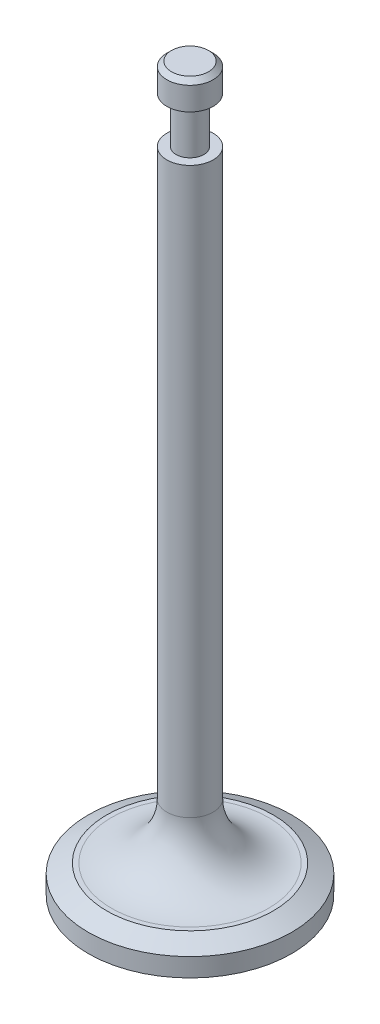
ISO-10303-21;
HEADER;
FILE_DESCRIPTION(('STEP AP214'),'2;1');
FILE_NAME('part.step','',(''),(''),'','','');
FILE_SCHEMA(('AUTOMOTIVE_DESIGN { 1 0 10303 214 1 1 1 1 }'));
ENDSEC;
DATA;
#1=APPLICATION_CONTEXT('core data for automotive mechanical design processes');
#2=APPLICATION_PROTOCOL_DEFINITION('international standard','automotive_design',2000,#1);
#3=PRODUCT_CONTEXT('',#1,'mechanical');
#4=PRODUCT('Part','Part','',(#3));
#5=PRODUCT_RELATED_PRODUCT_CATEGORY('part','',(#4));
#6=PRODUCT_DEFINITION_FORMATION('','',#4);
#7=PRODUCT_DEFINITION_CONTEXT('part definition',#1,'design');
#8=PRODUCT_DEFINITION('design','',#6,#7);
#9=PRODUCT_DEFINITION_SHAPE('','',#8);
#10=(LENGTH_UNIT() NAMED_UNIT(*) SI_UNIT(.MILLI.,.METRE.));
#11=(NAMED_UNIT(*) PLANE_ANGLE_UNIT() SI_UNIT($,.RADIAN.));
#12=(NAMED_UNIT(*) SI_UNIT($,.STERADIAN.) SOLID_ANGLE_UNIT());
#13=UNCERTAINTY_MEASURE_WITH_UNIT(LENGTH_MEASURE(1.E-05),#10,'distance_accuracy_value','');
#14=(GEOMETRIC_REPRESENTATION_CONTEXT(3) GLOBAL_UNCERTAINTY_ASSIGNED_CONTEXT((#13)) GLOBAL_UNIT_ASSIGNED_CONTEXT((#10,
#11,#12)) REPRESENTATION_CONTEXT('',''));
#15=CARTESIAN_POINT('',(0.,0.,0.));
#16=DIRECTION('',(0.,0.,1.));
#17=DIRECTION('',(1.,0.,0.));
#18=AXIS2_PLACEMENT_3D('',#15,#16,#17);
#19=CARTESIAN_POINT('',(0.,0.,-2.50000000000002));
#20=DIRECTION('',(0.,-1.,0.));
#21=DIRECTION('',(0.,0.,-1.));
#22=AXIS2_PLACEMENT_3D('',#19,#20,#21);
#23=PLANE('',#22);
#24=CARTESIAN_POINT('',(0.,0.,0.));
#25=DIRECTION('',(0.,-1.,0.));
#26=DIRECTION('',(0.,0.,-1.));
#27=AXIS2_PLACEMENT_3D('',#24,#25,#26);
#28=CIRCLE('',#27,2.00000000000002);
#29=CARTESIAN_POINT('',(0.,0.,-2.00000000000002));
#30=VERTEX_POINT('',#29);
#31=EDGE_CURVE('E48',#30,#30,#28,.F.);
#32=ORIENTED_EDGE('',*,*,#31,.T.);
#33=EDGE_LOOP('',(#32));
#34=FACE_BOUND('',#33,.T.);
#35=ADVANCED_FACE('F39',(#34),#23,.F.);
#36=CARTESIAN_POINT('',(0.,-78.0671289875173,0.));
#37=DIRECTION('',(0.,1.,0.));
#38=DIRECTION('',(0.,0.,1.));
#39=AXIS2_PLACEMENT_3D('',#36,#37,#38);
#40=PLANE('',#39);
#41=CARTESIAN_POINT('',(0.,-78.0671289875173,0.));
#42=DIRECTION('',(0.,1.,0.));
#43=DIRECTION('',(0.,0.,1.));
#44=AXIS2_PLACEMENT_3D('',#41,#42,#43);
#45=CIRCLE('',#44,11.);
#46=CARTESIAN_POINT('',(0.,-78.0671289875173,11.));
#47=VERTEX_POINT('',#46);
#48=EDGE_CURVE('E72',#47,#47,#45,.T.);
#49=ORIENTED_EDGE('',*,*,#48,.F.);
#50=EDGE_LOOP('',(#49));
#51=FACE_BOUND('',#50,.T.);
#52=ADVANCED_FACE('F125',(#51),#40,.F.);
#53=CARTESIAN_POINT('',(0.,0.,0.));
#54=DIRECTION('',(0.,1.,0.));
#55=DIRECTION('',(0.,0.,1.));
#56=AXIS2_PLACEMENT_3D('',#53,#54,#55);
#57=CYLINDRICAL_SURFACE('',#56,11.);
#58=CARTESIAN_POINT('',(0.,-76.0671289875174,0.));
#59=DIRECTION('',(0.,-1.,0.));
#60=DIRECTION('',(0.,0.,-1.));
#61=AXIS2_PLACEMENT_3D('',#58,#59,#60);
#62=CIRCLE('',#61,11.);
#63=CARTESIAN_POINT('',(0.,-76.0671289875174,-11.));
#64=VERTEX_POINT('',#63);
#65=EDGE_CURVE('E53',#64,#64,#62,.T.);
#66=ORIENTED_EDGE('',*,*,#65,.T.);
#67=EDGE_LOOP('',(#66));
#68=FACE_BOUND('',#67,.T.);
#69=ORIENTED_EDGE('',*,*,#48,.T.);
#70=EDGE_LOOP('',(#69));
#71=FACE_BOUND('',#70,.T.);
#72=ADVANCED_FACE('F121',(#68,#71),#57,.T.);
#73=CARTESIAN_POINT('',(0.,-75.0671289875173,-11.));
#74=DIRECTION('',(0.,-1.,0.));
#75=DIRECTION('',(0.,0.,-1.));
#76=AXIS2_PLACEMENT_3D('',#73,#74,#75);
#77=PLANE('',#76);
#78=CARTESIAN_POINT('',(0.,-75.0671289875173,0.));
#79=DIRECTION('',(0.,-1.,0.));
#80=DIRECTION('',(0.,0.,-1.));
#81=AXIS2_PLACEMENT_3D('',#78,#79,#80);
#82=CIRCLE('',#81,8.99999999999997);
#83=CARTESIAN_POINT('',(0.,-75.0671289875173,-8.99999999999997));
#84=VERTEX_POINT('',#83);
#85=EDGE_CURVE('E58',#84,#84,#82,.F.);
#86=ORIENTED_EDGE('',*,*,#85,.T.);
#87=EDGE_LOOP('',(#86));
#88=FACE_BOUND('',#87,.T.);
#89=CARTESIAN_POINT('',(0.,-75.0671289875173,0.));
#90=DIRECTION('',(0.,-1.,0.));
#91=DIRECTION('',(0.,0.,-1.));
#92=AXIS2_PLACEMENT_3D('',#89,#90,#91);
#93=CIRCLE('',#92,8.50000000000001);
#94=CARTESIAN_POINT('',(0.,-75.0671289875173,-8.50000000000001));
#95=VERTEX_POINT('',#94);
#96=EDGE_CURVE('E64',#95,#95,#93,.T.);
#97=ORIENTED_EDGE('',*,*,#96,.T.);
#98=EDGE_LOOP('',(#97));
#99=FACE_BOUND('',#98,.T.);
#100=ADVANCED_FACE('F115',(#88,#99),#77,.F.);
#101=CARTESIAN_POINT('',(0.,0.,0.));
#102=DIRECTION('',(0.,1.,0.));
#103=DIRECTION('',(0.,0.,1.));
#104=AXIS2_PLACEMENT_3D('',#101,#102,#103);
#105=CYLINDRICAL_SURFACE('',#104,2.50000000000001);
#106=CARTESIAN_POINT('',(0.,-69.0671289875173,0.));
#107=DIRECTION('',(0.,-1.,0.));
#108=DIRECTION('',(0.,0.,-1.));
#109=AXIS2_PLACEMENT_3D('',#106,#107,#108);
#110=CIRCLE('',#109,2.50000000000001);
#111=CARTESIAN_POINT('',(0.,-69.0671289875173,-2.50000000000001));
#112=VERTEX_POINT('',#111);
#113=EDGE_CURVE('E68',#112,#112,#110,.F.);
#114=ORIENTED_EDGE('',*,*,#113,.T.);
#115=EDGE_LOOP('',(#114));
#116=FACE_BOUND('',#115,.T.);
#117=CARTESIAN_POINT('',(0.,-8.,0.));
#118=DIRECTION('',(0.,1.,0.));
#119=DIRECTION('',(0.,0.,1.));
#120=AXIS2_PLACEMENT_3D('',#117,#118,#119);
#121=CIRCLE('',#120,2.50000000000001);
#122=CARTESIAN_POINT('',(0.,-8.,2.50000000000001));
#123=VERTEX_POINT('',#122);
#124=EDGE_CURVE('E76',#123,#123,#121,.T.);
#125=ORIENTED_EDGE('',*,*,#124,.F.);
#126=EDGE_LOOP('',(#125));
#127=FACE_BOUND('',#126,.T.);
#128=ADVANCED_FACE('F110',(#116,#127),#105,.T.);
#129=CARTESIAN_POINT('',(0.,-8.,-2.50000000000001));
#130=DIRECTION('',(0.,-1.,0.));
#131=DIRECTION('',(0.,0.,-1.));
#132=AXIS2_PLACEMENT_3D('',#129,#130,#131);
#133=PLANE('',#132);
#134=CARTESIAN_POINT('',(0.,-8.,0.));
#135=DIRECTION('',(0.,1.,0.));
#136=DIRECTION('',(0.,0.,1.));
#137=AXIS2_PLACEMENT_3D('',#134,#135,#136);
#138=CIRCLE('',#137,1.50000000000002);
#139=CARTESIAN_POINT('',(0.,-8.,1.50000000000002));
#140=VERTEX_POINT('',#139);
#141=EDGE_CURVE('E80',#140,#140,#138,.T.);
#142=ORIENTED_EDGE('',*,*,#141,.F.);
#143=EDGE_LOOP('',(#142));
#144=FACE_BOUND('',#143,.T.);
#145=ORIENTED_EDGE('',*,*,#124,.T.);
#146=EDGE_LOOP('',(#145));
#147=FACE_BOUND('',#146,.T.);
#148=ADVANCED_FACE('F104',(#144,#147),#133,.F.);
#149=CARTESIAN_POINT('',(0.,0.,0.));
#150=DIRECTION('',(0.,1.,0.));
#151=DIRECTION('',(0.,0.,1.));
#152=AXIS2_PLACEMENT_3D('',#149,#150,#151);
#153=CYLINDRICAL_SURFACE('',#152,1.50000000000002);
#154=CARTESIAN_POINT('',(0.,-3.,0.));
#155=DIRECTION('',(0.,1.,0.));
#156=DIRECTION('',(0.,0.,1.));
#157=AXIS2_PLACEMENT_3D('',#154,#155,#156);
#158=CIRCLE('',#157,1.50000000000002);
#159=CARTESIAN_POINT('',(0.,-3.,1.50000000000002));
#160=VERTEX_POINT('',#159);
#161=EDGE_CURVE('E84',#160,#160,#158,.T.);
#162=ORIENTED_EDGE('',*,*,#161,.F.);
#163=EDGE_LOOP('',(#162));
#164=FACE_BOUND('',#163,.T.);
#165=ORIENTED_EDGE('',*,*,#141,.T.);
#166=EDGE_LOOP('',(#165));
#167=FACE_BOUND('',#166,.T.);
#168=ADVANCED_FACE('F98',(#164,#167),#153,.T.);
#169=CARTESIAN_POINT('',(0.,-3.,-1.50000000000002));
#170=DIRECTION('',(0.,1.,0.));
#171=DIRECTION('',(0.,0.,1.));
#172=AXIS2_PLACEMENT_3D('',#169,#170,#171);
#173=PLANE('',#172);
#174=CARTESIAN_POINT('',(0.,-3.,0.));
#175=DIRECTION('',(0.,1.,0.));
#176=DIRECTION('',(0.,0.,1.));
#177=AXIS2_PLACEMENT_3D('',#174,#175,#176);
#178=CIRCLE('',#177,2.50000000000002);
#179=CARTESIAN_POINT('',(0.,-3.,2.50000000000002));
#180=VERTEX_POINT('',#179);
#181=EDGE_CURVE('E88',#180,#180,#178,.T.);
#182=ORIENTED_EDGE('',*,*,#181,.F.);
#183=EDGE_LOOP('',(#182));
#184=FACE_BOUND('',#183,.T.);
#185=ORIENTED_EDGE('',*,*,#161,.T.);
#186=EDGE_LOOP('',(#185));
#187=FACE_BOUND('',#186,.T.);
#188=ADVANCED_FACE('F95',(#184,#187),#173,.F.);
#189=CARTESIAN_POINT('',(0.,0.,0.));
#190=DIRECTION('',(0.,1.,0.));
#191=DIRECTION('',(0.,0.,1.));
#192=AXIS2_PLACEMENT_3D('',#189,#190,#191);
#193=CYLINDRICAL_SURFACE('',#192,2.50000000000002);
#194=CARTESIAN_POINT('',(0.,-0.500000000000005,0.));
#195=DIRECTION('',(0.,-1.,0.));
#196=DIRECTION('',(0.,0.,-1.));
#197=AXIS2_PLACEMENT_3D('',#194,#195,#196);
#198=CIRCLE('',#197,2.50000000000002);
#199=CARTESIAN_POINT('',(0.,-0.500000000000005,-2.50000000000002));
#200=VERTEX_POINT('',#199);
#201=EDGE_CURVE('E10',#200,#200,#198,.T.);
#202=ORIENTED_EDGE('',*,*,#201,.T.);
#203=EDGE_LOOP('',(#202));
#204=FACE_BOUND('',#203,.T.);
#205=ORIENTED_EDGE('',*,*,#181,.T.);
#206=EDGE_LOOP('',(#205));
#207=FACE_BOUND('',#206,.T.);
#208=ADVANCED_FACE('F93',(#204,#207),#193,.T.);
#209=CARTESIAN_POINT('',(0.,-69.0671289875173,0.));
#210=DIRECTION('',(0.,-1.,0.));
#211=DIRECTION('',(0.,0.,-1.));
#212=AXIS2_PLACEMENT_3D('',#209,#210,#211);
#213=TOROIDAL_SURFACE('',#212,8.50000000000001,6.);
#214=ORIENTED_EDGE('',*,*,#96,.F.);
#215=EDGE_LOOP('',(#214));
#216=FACE_BOUND('',#215,.T.);
#217=ORIENTED_EDGE('',*,*,#113,.F.);
#218=EDGE_LOOP('',(#217));
#219=FACE_BOUND('',#218,.T.);
#220=ADVANCED_FACE('F134',(#216,#219),#213,.F.);
#221=CARTESIAN_POINT('',(0.,-75.0671289875173,0.));
#222=DIRECTION('',(0.,-1.,0.));
#223=DIRECTION('',(0.,0.,-1.));
#224=AXIS2_PLACEMENT_3D('',#221,#222,#223);
#225=CONICAL_SURFACE('',#224,8.99999999999997,1.10714871779409);
#226=ORIENTED_EDGE('',*,*,#65,.F.);
#227=EDGE_LOOP('',(#226));
#228=FACE_BOUND('',#227,.T.);
#229=ORIENTED_EDGE('',*,*,#85,.F.);
#230=EDGE_LOOP('',(#229));
#231=FACE_BOUND('',#230,.T.);
#232=ADVANCED_FACE('F136',(#228,#231),#225,.T.);
#233=CARTESIAN_POINT('',(0.,0.,0.));
#234=DIRECTION('',(0.,-1.,0.));
#235=DIRECTION('',(0.,0.,-1.));
#236=AXIS2_PLACEMENT_3D('',#233,#234,#235);
#237=CONICAL_SURFACE('',#236,2.00000000000002,0.785398163397447);
#238=ORIENTED_EDGE('',*,*,#201,.F.);
#239=EDGE_LOOP('',(#238));
#240=FACE_BOUND('',#239,.T.);
#241=ORIENTED_EDGE('',*,*,#31,.F.);
#242=EDGE_LOOP('',(#241));
#243=FACE_BOUND('',#242,.T.);
#244=ADVANCED_FACE('F42',(#240,#243),#237,.T.);
#245=CLOSED_SHELL('',(#35,#52,#72,#100,#128,#148,#168,#188,#208,#220,#232,#244));
#246=MANIFOLD_SOLID_BREP('B2',#245);
#247=ADVANCED_BREP_SHAPE_REPRESENTATION('',(#18,#246),#14);
#248=SHAPE_DEFINITION_REPRESENTATION(#9,#247);
ENDSEC;
END-ISO-10303-21;
